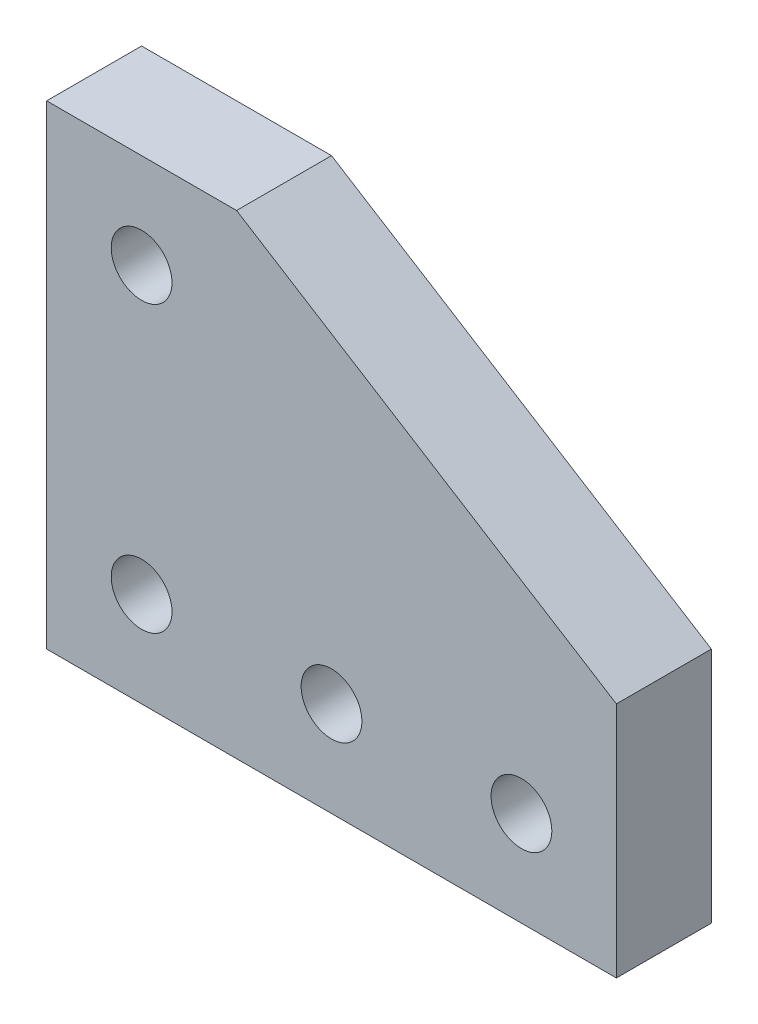
ISO-10303-21;
HEADER;
FILE_DESCRIPTION(('STEP AP214'),'2;1');
FILE_NAME('part.step','',(''),(''),'','','');
FILE_SCHEMA(('AUTOMOTIVE_DESIGN { 1 0 10303 214 1 1 1 1 }'));
ENDSEC;
DATA;
#1=APPLICATION_CONTEXT('core data for automotive mechanical design processes');
#2=APPLICATION_PROTOCOL_DEFINITION('international standard','automotive_design',2000,#1);
#3=PRODUCT_CONTEXT('',#1,'mechanical');
#4=PRODUCT('Part','Part','',(#3));
#5=PRODUCT_RELATED_PRODUCT_CATEGORY('part','',(#4));
#6=PRODUCT_DEFINITION_FORMATION('','',#4);
#7=PRODUCT_DEFINITION_CONTEXT('part definition',#1,'design');
#8=PRODUCT_DEFINITION('design','',#6,#7);
#9=PRODUCT_DEFINITION_SHAPE('','',#8);
#10=(LENGTH_UNIT() NAMED_UNIT(*) SI_UNIT(.MILLI.,.METRE.));
#11=(NAMED_UNIT(*) PLANE_ANGLE_UNIT() SI_UNIT($,.RADIAN.));
#12=(NAMED_UNIT(*) SI_UNIT($,.STERADIAN.) SOLID_ANGLE_UNIT());
#13=UNCERTAINTY_MEASURE_WITH_UNIT(LENGTH_MEASURE(1.E-05),#10,'distance_accuracy_value','');
#14=(GEOMETRIC_REPRESENTATION_CONTEXT(3) GLOBAL_UNCERTAINTY_ASSIGNED_CONTEXT((#13)) GLOBAL_UNIT_ASSIGNED_CONTEXT((#10,
#11,#12)) REPRESENTATION_CONTEXT('',''));
#15=CARTESIAN_POINT('',(0.,0.,0.));
#16=DIRECTION('',(0.,0.,1.));
#17=DIRECTION('',(1.,0.,0.));
#18=AXIS2_PLACEMENT_3D('',#15,#16,#17);
#19=CARTESIAN_POINT('',(15.,12.5,5.));
#20=DIRECTION('',(-1.,0.,0.));
#21=DIRECTION('',(0.,-1.,0.));
#22=AXIS2_PLACEMENT_3D('',#19,#20,#21);
#23=PLANE('',#22);
#24=DIRECTION('',(0.,0.,-1.));
#25=VECTOR('',#24,1.);
#26=CARTESIAN_POINT('',(15.,0.,60.4625492125738));
#27=LINE('',#26,#25);
#28=CARTESIAN_POINT('',(15.,0.,5.00000000000001));
#29=VERTEX_POINT('',#28);
#30=CARTESIAN_POINT('',(15.,0.,0.));
#31=VERTEX_POINT('',#30);
#32=EDGE_CURVE('E47',#29,#31,#27,.T.);
#33=ORIENTED_EDGE('',*,*,#32,.F.);
#34=DIRECTION('',(0.,1.,0.));
#35=VECTOR('',#34,1.);
#36=CARTESIAN_POINT('',(15.,12.5,5.));
#37=LINE('',#36,#35);
#38=CARTESIAN_POINT('',(15.,-12.5,5.));
#39=VERTEX_POINT('',#38);
#40=EDGE_CURVE('E111',#39,#29,#37,.T.);
#41=ORIENTED_EDGE('',*,*,#40,.F.);
#42=DIRECTION('',(0.,0.,-1.));
#43=VECTOR('',#42,1.);
#44=CARTESIAN_POINT('',(15.,-12.5,5.));
#45=LINE('',#44,#43);
#46=CARTESIAN_POINT('',(15.,-12.5,0.));
#47=VERTEX_POINT('',#46);
#48=EDGE_CURVE('E112',#39,#47,#45,.T.);
#49=ORIENTED_EDGE('',*,*,#48,.T.);
#50=DIRECTION('',(0.,1.,0.));
#51=VECTOR('',#50,1.);
#52=CARTESIAN_POINT('',(15.,12.5,0.));
#53=LINE('',#52,#51);
#54=EDGE_CURVE('E103',#47,#31,#53,.T.);
#55=ORIENTED_EDGE('',*,*,#54,.T.);
#56=EDGE_LOOP('',(#33,#41,#49,#55));
#57=FACE_BOUND('',#56,.T.);
#58=ADVANCED_FACE('F33',(#57),#23,.F.);
#59=CARTESIAN_POINT('',(-15.,12.5,5.));
#60=DIRECTION('',(0.,-1.,0.));
#61=DIRECTION('',(0.,0.,-1.));
#62=AXIS2_PLACEMENT_3D('',#59,#60,#61);
#63=PLANE('',#62);
#64=DIRECTION('',(0.,0.,-1.));
#65=VECTOR('',#64,1.);
#66=CARTESIAN_POINT('',(-5.,12.5,60.4625492125738));
#67=LINE('',#66,#65);
#68=CARTESIAN_POINT('',(-5.,12.5,5.00000000000001));
#69=VERTEX_POINT('',#68);
#70=CARTESIAN_POINT('',(-5.00000000000002,12.5,0.));
#71=VERTEX_POINT('',#70);
#72=EDGE_CURVE('E89',#69,#71,#67,.T.);
#73=ORIENTED_EDGE('',*,*,#72,.T.);
#74=DIRECTION('',(-1.,0.,0.));
#75=VECTOR('',#74,1.);
#76=CARTESIAN_POINT('',(-15.,12.5,0.));
#77=LINE('',#76,#75);
#78=CARTESIAN_POINT('',(-15.,12.5,0.));
#79=VERTEX_POINT('',#78);
#80=EDGE_CURVE('E97',#71,#79,#77,.T.);
#81=ORIENTED_EDGE('',*,*,#80,.T.);
#82=DIRECTION('',(0.,0.,-1.));
#83=VECTOR('',#82,1.);
#84=CARTESIAN_POINT('',(-15.,12.5,5.));
#85=LINE('',#84,#83);
#86=CARTESIAN_POINT('',(-15.,12.5,5.));
#87=VERTEX_POINT('',#86);
#88=EDGE_CURVE('E11',#87,#79,#85,.T.);
#89=ORIENTED_EDGE('',*,*,#88,.F.);
#90=DIRECTION('',(-1.,0.,0.));
#91=VECTOR('',#90,1.);
#92=CARTESIAN_POINT('',(-15.,12.5,5.));
#93=LINE('',#92,#91);
#94=EDGE_CURVE('E78',#69,#87,#93,.T.);
#95=ORIENTED_EDGE('',*,*,#94,.F.);
#96=EDGE_LOOP('',(#73,#81,#89,#95));
#97=FACE_BOUND('',#96,.T.);
#98=ADVANCED_FACE('F96',(#97),#63,.F.);
#99=CARTESIAN_POINT('',(0.,0.,5.));
#100=DIRECTION('',(0.,0.,1.));
#101=DIRECTION('',(1.,0.,0.));
#102=AXIS2_PLACEMENT_3D('',#99,#100,#101);
#103=PLANE('',#102);
#104=CARTESIAN_POINT('',(-10.0000000000001,7.5,5.));
#105=DIRECTION('',(0.,0.,1.));
#106=DIRECTION('',(1.,0.,0.));
#107=AXIS2_PLACEMENT_3D('',#104,#105,#106);
#108=CIRCLE('',#107,1.6);
#109=CARTESIAN_POINT('',(-8.40000000000006,7.5,5.));
#110=VERTEX_POINT('',#109);
#111=EDGE_CURVE('E234',#110,#110,#108,.T.);
#112=ORIENTED_EDGE('',*,*,#111,.F.);
#113=EDGE_LOOP('',(#112));
#114=FACE_BOUND('',#113,.T.);
#115=CARTESIAN_POINT('',(9.99999999999999,-7.5,5.));
#116=DIRECTION('',(0.,0.,1.));
#117=DIRECTION('',(1.,0.,0.));
#118=AXIS2_PLACEMENT_3D('',#115,#116,#117);
#119=CIRCLE('',#118,1.6);
#120=CARTESIAN_POINT('',(11.6,-7.5,5.));
#121=VERTEX_POINT('',#120);
#122=EDGE_CURVE('E233',#121,#121,#119,.T.);
#123=ORIENTED_EDGE('',*,*,#122,.F.);
#124=EDGE_LOOP('',(#123));
#125=FACE_BOUND('',#124,.T.);
#126=CARTESIAN_POINT('',(0.,-7.5,5.));
#127=DIRECTION('',(0.,0.,1.));
#128=DIRECTION('',(1.,0.,0.));
#129=AXIS2_PLACEMENT_3D('',#126,#127,#128);
#130=CIRCLE('',#129,1.6);
#131=CARTESIAN_POINT('',(1.6,-7.5,5.));
#132=VERTEX_POINT('',#131);
#133=EDGE_CURVE('E227',#132,#132,#130,.T.);
#134=ORIENTED_EDGE('',*,*,#133,.F.);
#135=EDGE_LOOP('',(#134));
#136=FACE_BOUND('',#135,.T.);
#137=CARTESIAN_POINT('',(-10.,-7.5,5.));
#138=DIRECTION('',(0.,0.,1.));
#139=DIRECTION('',(1.,0.,0.));
#140=AXIS2_PLACEMENT_3D('',#137,#138,#139);
#141=CIRCLE('',#140,1.6);
#142=CARTESIAN_POINT('',(-8.4,-7.5,5.));
#143=VERTEX_POINT('',#142);
#144=EDGE_CURVE('E221',#143,#143,#141,.T.);
#145=ORIENTED_EDGE('',*,*,#144,.F.);
#146=EDGE_LOOP('',(#145));
#147=FACE_BOUND('',#146,.T.);
#148=ORIENTED_EDGE('',*,*,#40,.T.);
#149=DIRECTION('',(0.847998304005088,-0.52999894000318,0.));
#150=VECTOR('',#149,1.);
#151=CARTESIAN_POINT('',(-5.,12.5,5.));
#152=LINE('',#151,#150);
#153=EDGE_CURVE('E98',#69,#29,#152,.T.);
#154=ORIENTED_EDGE('',*,*,#153,.F.);
#155=ORIENTED_EDGE('',*,*,#94,.T.);
#156=DIRECTION('',(0.,-1.,0.));
#157=VECTOR('',#156,1.);
#158=CARTESIAN_POINT('',(-15.,12.5,5.));
#159=LINE('',#158,#157);
#160=CARTESIAN_POINT('',(-15.,-12.5,5.));
#161=VERTEX_POINT('',#160);
#162=EDGE_CURVE('E120',#87,#161,#159,.T.);
#163=ORIENTED_EDGE('',*,*,#162,.T.);
#164=DIRECTION('',(1.,0.,0.));
#165=VECTOR('',#164,1.);
#166=CARTESIAN_POINT('',(-15.,-12.5,5.));
#167=LINE('',#166,#165);
#168=EDGE_CURVE('E56',#161,#39,#167,.T.);
#169=ORIENTED_EDGE('',*,*,#168,.T.);
#170=EDGE_LOOP('',(#148,#154,#155,#163,#169));
#171=FACE_BOUND('',#170,.T.);
#172=ADVANCED_FACE('F125',(#114,#125,#136,#147,#171),#103,.T.);
#173=CARTESIAN_POINT('',(-15.,12.5,5.));
#174=DIRECTION('',(1.,0.,0.));
#175=DIRECTION('',(0.,1.,0.));
#176=AXIS2_PLACEMENT_3D('',#173,#174,#175);
#177=PLANE('',#176);
#178=DIRECTION('',(0.,-1.,0.));
#179=VECTOR('',#178,1.);
#180=CARTESIAN_POINT('',(-15.,12.5,0.));
#181=LINE('',#180,#179);
#182=CARTESIAN_POINT('',(-15.,-12.5,0.));
#183=VERTEX_POINT('',#182);
#184=EDGE_CURVE('E102',#79,#183,#181,.T.);
#185=ORIENTED_EDGE('',*,*,#184,.T.);
#186=DIRECTION('',(0.,0.,-1.));
#187=VECTOR('',#186,1.);
#188=CARTESIAN_POINT('',(-15.,-12.5,5.));
#189=LINE('',#188,#187);
#190=EDGE_CURVE('E40',#161,#183,#189,.T.);
#191=ORIENTED_EDGE('',*,*,#190,.F.);
#192=ORIENTED_EDGE('',*,*,#162,.F.);
#193=ORIENTED_EDGE('',*,*,#88,.T.);
#194=EDGE_LOOP('',(#185,#191,#192,#193));
#195=FACE_BOUND('',#194,.T.);
#196=ADVANCED_FACE('F126',(#195),#177,.F.);
#197=CARTESIAN_POINT('',(-15.,-12.5,5.));
#198=DIRECTION('',(0.,1.,0.));
#199=DIRECTION('',(0.,0.,1.));
#200=AXIS2_PLACEMENT_3D('',#197,#198,#199);
#201=PLANE('',#200);
#202=DIRECTION('',(1.,0.,0.));
#203=VECTOR('',#202,1.);
#204=CARTESIAN_POINT('',(-15.,-12.5,0.));
#205=LINE('',#204,#203);
#206=EDGE_CURVE('E73',#183,#47,#205,.T.);
#207=ORIENTED_EDGE('',*,*,#206,.T.);
#208=ORIENTED_EDGE('',*,*,#48,.F.);
#209=ORIENTED_EDGE('',*,*,#168,.F.);
#210=ORIENTED_EDGE('',*,*,#190,.T.);
#211=EDGE_LOOP('',(#207,#208,#209,#210));
#212=FACE_BOUND('',#211,.T.);
#213=ADVANCED_FACE('F114',(#212),#201,.F.);
#214=CARTESIAN_POINT('',(0.,0.,0.));
#215=DIRECTION('',(0.,0.,1.));
#216=DIRECTION('',(1.,0.,0.));
#217=AXIS2_PLACEMENT_3D('',#214,#215,#216);
#218=PLANE('',#217);
#219=CARTESIAN_POINT('',(-10.0000000000001,7.5,0.));
#220=DIRECTION('',(0.,0.,1.));
#221=DIRECTION('',(1.,0.,0.));
#222=AXIS2_PLACEMENT_3D('',#219,#220,#221);
#223=CIRCLE('',#222,1.6);
#224=CARTESIAN_POINT('',(-8.40000000000006,7.5,0.));
#225=VERTEX_POINT('',#224);
#226=EDGE_CURVE('E230',#225,#225,#223,.F.);
#227=ORIENTED_EDGE('',*,*,#226,.F.);
#228=EDGE_LOOP('',(#227));
#229=FACE_BOUND('',#228,.T.);
#230=CARTESIAN_POINT('',(9.99999999999999,-7.5,0.));
#231=DIRECTION('',(0.,0.,1.));
#232=DIRECTION('',(1.,0.,0.));
#233=AXIS2_PLACEMENT_3D('',#230,#231,#232);
#234=CIRCLE('',#233,1.6);
#235=CARTESIAN_POINT('',(11.6,-7.5,0.));
#236=VERTEX_POINT('',#235);
#237=EDGE_CURVE('E237',#236,#236,#234,.F.);
#238=ORIENTED_EDGE('',*,*,#237,.F.);
#239=EDGE_LOOP('',(#238));
#240=FACE_BOUND('',#239,.T.);
#241=CARTESIAN_POINT('',(0.,-7.5,0.));
#242=DIRECTION('',(0.,0.,1.));
#243=DIRECTION('',(1.,0.,0.));
#244=AXIS2_PLACEMENT_3D('',#241,#242,#243);
#245=CIRCLE('',#244,1.6);
#246=CARTESIAN_POINT('',(1.6,-7.5,0.));
#247=VERTEX_POINT('',#246);
#248=EDGE_CURVE('E225',#247,#247,#245,.F.);
#249=ORIENTED_EDGE('',*,*,#248,.F.);
#250=EDGE_LOOP('',(#249));
#251=FACE_BOUND('',#250,.T.);
#252=CARTESIAN_POINT('',(-10.,-7.5,0.));
#253=DIRECTION('',(0.,0.,1.));
#254=DIRECTION('',(1.,0.,0.));
#255=AXIS2_PLACEMENT_3D('',#252,#253,#254);
#256=CIRCLE('',#255,1.6);
#257=CARTESIAN_POINT('',(-8.4,-7.5,0.));
#258=VERTEX_POINT('',#257);
#259=EDGE_CURVE('E106',#258,#258,#256,.F.);
#260=ORIENTED_EDGE('',*,*,#259,.F.);
#261=EDGE_LOOP('',(#260));
#262=FACE_BOUND('',#261,.T.);
#263=ORIENTED_EDGE('',*,*,#80,.F.);
#264=DIRECTION('',(0.847998304005088,-0.52999894000318,0.));
#265=VECTOR('',#264,1.);
#266=CARTESIAN_POINT('',(-5.,12.5,0.));
#267=LINE('',#266,#265);
#268=EDGE_CURVE('E86',#71,#31,#267,.T.);
#269=ORIENTED_EDGE('',*,*,#268,.T.);
#270=ORIENTED_EDGE('',*,*,#54,.F.);
#271=ORIENTED_EDGE('',*,*,#206,.F.);
#272=ORIENTED_EDGE('',*,*,#184,.F.);
#273=EDGE_LOOP('',(#263,#269,#270,#271,#272));
#274=FACE_BOUND('',#273,.T.);
#275=ADVANCED_FACE('F101',(#229,#240,#251,#262,#274),#218,.F.);
#276=CARTESIAN_POINT('',(-10.,-7.5,-0.00100000000000013));
#277=DIRECTION('',(0.,0.,1.));
#278=DIRECTION('',(1.,0.,0.));
#279=AXIS2_PLACEMENT_3D('',#276,#277,#278);
#280=CYLINDRICAL_SURFACE('',#279,1.6);
#281=ORIENTED_EDGE('',*,*,#144,.T.);
#282=EDGE_LOOP('',(#281));
#283=FACE_BOUND('',#282,.T.);
#284=ORIENTED_EDGE('',*,*,#259,.T.);
#285=EDGE_LOOP('',(#284));
#286=FACE_BOUND('',#285,.T.);
#287=ADVANCED_FACE('F156',(#283,#286),#280,.F.);
#288=CARTESIAN_POINT('',(0.,-7.5,-0.00100000000000013));
#289=DIRECTION('',(0.,0.,1.));
#290=DIRECTION('',(1.,0.,0.));
#291=AXIS2_PLACEMENT_3D('',#288,#289,#290);
#292=CYLINDRICAL_SURFACE('',#291,1.6);
#293=ORIENTED_EDGE('',*,*,#133,.T.);
#294=EDGE_LOOP('',(#293));
#295=FACE_BOUND('',#294,.T.);
#296=ORIENTED_EDGE('',*,*,#248,.T.);
#297=EDGE_LOOP('',(#296));
#298=FACE_BOUND('',#297,.T.);
#299=ADVANCED_FACE('F185',(#295,#298),#292,.F.);
#300=CARTESIAN_POINT('',(9.99999999999999,-7.5,-0.00100000000000013));
#301=DIRECTION('',(0.,0.,1.));
#302=DIRECTION('',(1.,0.,0.));
#303=AXIS2_PLACEMENT_3D('',#300,#301,#302);
#304=CYLINDRICAL_SURFACE('',#303,1.6);
#305=ORIENTED_EDGE('',*,*,#122,.T.);
#306=EDGE_LOOP('',(#305));
#307=FACE_BOUND('',#306,.T.);
#308=ORIENTED_EDGE('',*,*,#237,.T.);
#309=EDGE_LOOP('',(#308));
#310=FACE_BOUND('',#309,.T.);
#311=ADVANCED_FACE('F178',(#307,#310),#304,.F.);
#312=CARTESIAN_POINT('',(-10.0000000000001,7.5,-0.00100000000000013));
#313=DIRECTION('',(0.,0.,1.));
#314=DIRECTION('',(1.,0.,0.));
#315=AXIS2_PLACEMENT_3D('',#312,#313,#314);
#316=CYLINDRICAL_SURFACE('',#315,1.6);
#317=ORIENTED_EDGE('',*,*,#111,.T.);
#318=EDGE_LOOP('',(#317));
#319=FACE_BOUND('',#318,.T.);
#320=ORIENTED_EDGE('',*,*,#226,.T.);
#321=EDGE_LOOP('',(#320));
#322=FACE_BOUND('',#321,.T.);
#323=ADVANCED_FACE('F168',(#319,#322),#316,.F.);
#324=CARTESIAN_POINT('',(-5.,12.5,60.4625492125738));
#325=DIRECTION('',(0.52999894000318,0.847998304005088,0.));
#326=DIRECTION('',(-0.847998304005088,0.52999894000318,0.));
#327=AXIS2_PLACEMENT_3D('',#324,#325,#326);
#328=PLANE('',#327);
#329=ORIENTED_EDGE('',*,*,#72,.F.);
#330=ORIENTED_EDGE('',*,*,#153,.T.);
#331=ORIENTED_EDGE('',*,*,#32,.T.);
#332=ORIENTED_EDGE('',*,*,#268,.F.);
#333=EDGE_LOOP('',(#329,#330,#331,#332));
#334=FACE_BOUND('',#333,.T.);
#335=ADVANCED_FACE('F88',(#334),#328,.T.);
#336=CLOSED_SHELL('',(#58,#98,#172,#196,#213,#275,#287,#299,#311,#323,#335));
#337=MANIFOLD_SOLID_BREP('B2',#336);
#338=ADVANCED_BREP_SHAPE_REPRESENTATION('',(#18,#337),#14);
#339=SHAPE_DEFINITION_REPRESENTATION(#9,#338);
ENDSEC;
END-ISO-10303-21;
